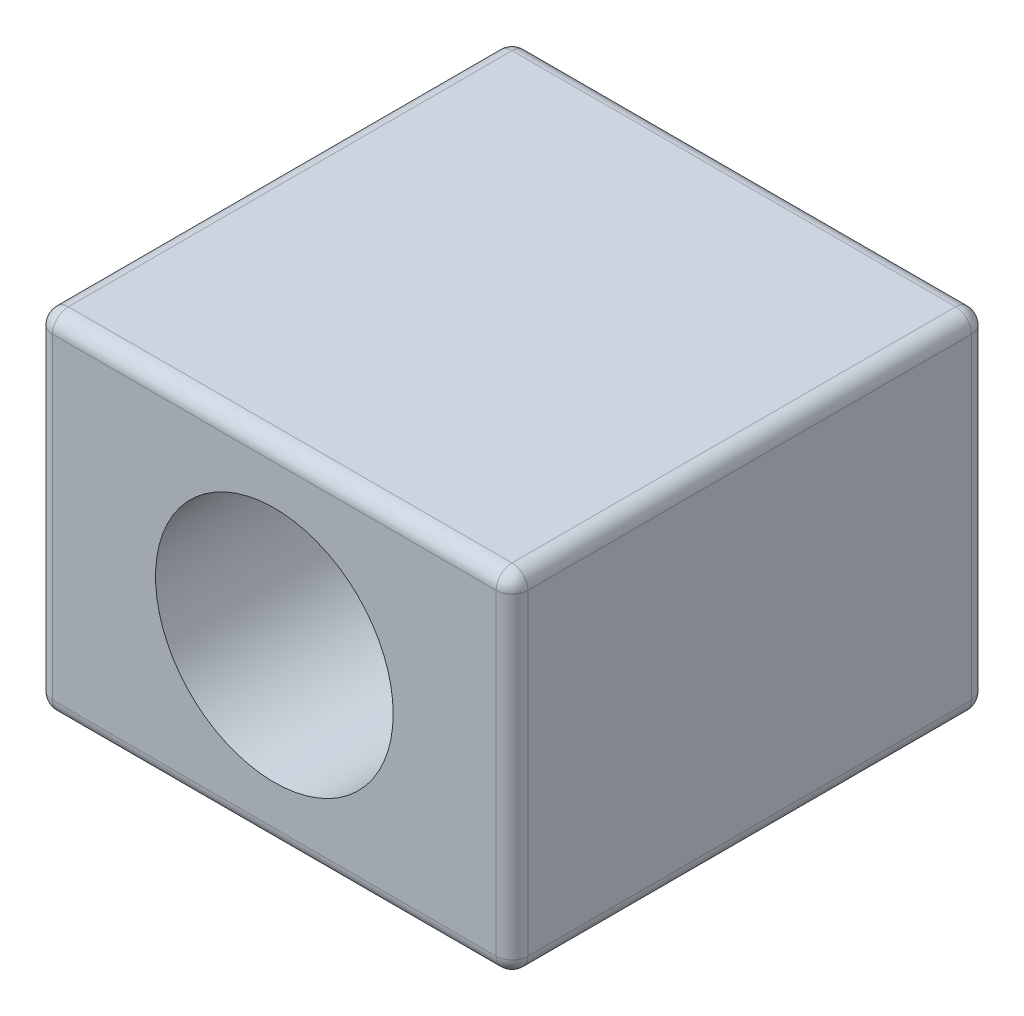
ISO-10303-21;
HEADER;
FILE_DESCRIPTION(('STEP AP214'),'2;1');
FILE_NAME('part.step','',(''),(''),'','','');
FILE_SCHEMA(('AUTOMOTIVE_DESIGN { 1 0 10303 214 1 1 1 1 }'));
ENDSEC;
DATA;
#1=APPLICATION_CONTEXT('core data for automotive mechanical design processes');
#2=APPLICATION_PROTOCOL_DEFINITION('international standard','automotive_design',2000,#1);
#3=PRODUCT_CONTEXT('',#1,'mechanical');
#4=PRODUCT('Part','Part','',(#3));
#5=PRODUCT_RELATED_PRODUCT_CATEGORY('part','',(#4));
#6=PRODUCT_DEFINITION_FORMATION('','',#4);
#7=PRODUCT_DEFINITION_CONTEXT('part definition',#1,'design');
#8=PRODUCT_DEFINITION('design','',#6,#7);
#9=PRODUCT_DEFINITION_SHAPE('','',#8);
#10=(LENGTH_UNIT() NAMED_UNIT(*) SI_UNIT(.MILLI.,.METRE.));
#11=(NAMED_UNIT(*) PLANE_ANGLE_UNIT() SI_UNIT($,.RADIAN.));
#12=(NAMED_UNIT(*) SI_UNIT($,.STERADIAN.) SOLID_ANGLE_UNIT());
#13=UNCERTAINTY_MEASURE_WITH_UNIT(LENGTH_MEASURE(1.E-05),#10,'distance_accuracy_value','');
#14=(GEOMETRIC_REPRESENTATION_CONTEXT(3) GLOBAL_UNCERTAINTY_ASSIGNED_CONTEXT((#13)) GLOBAL_UNIT_ASSIGNED_CONTEXT((#10,
#11,#12)) REPRESENTATION_CONTEXT('',''));
#15=CARTESIAN_POINT('',(0.,0.,0.));
#16=DIRECTION('',(0.,0.,1.));
#17=DIRECTION('',(1.,0.,0.));
#18=AXIS2_PLACEMENT_3D('',#15,#16,#17);
#19=CARTESIAN_POINT('',(-7.5,-5.50000000000006,7.5));
#20=DIRECTION('',(0.,0.,1.));
#21=DIRECTION('',(1.,0.,0.));
#22=AXIS2_PLACEMENT_3D('',#19,#20,#21);
#23=PLANE('',#22);
#24=DIRECTION('',(0.,-1.,0.));
#25=VECTOR('',#24,1.);
#26=CARTESIAN_POINT('',(-7.,-5.50000000000006,7.5));
#27=LINE('',#26,#25);
#28=CARTESIAN_POINT('',(-7.,5.00000000000006,7.5));
#29=VERTEX_POINT('',#28);
#30=CARTESIAN_POINT('',(-7.,-5.00000000000006,7.5));
#31=VERTEX_POINT('',#30);
#32=EDGE_CURVE('E124',#29,#31,#27,.T.);
#33=ORIENTED_EDGE('',*,*,#32,.T.);
#34=DIRECTION('',(1.,0.,0.));
#35=VECTOR('',#34,1.);
#36=CARTESIAN_POINT('',(7.5,-5.00000000000006,7.5));
#37=LINE('',#36,#35);
#38=CARTESIAN_POINT('',(7.,-5.00000000000006,7.5));
#39=VERTEX_POINT('',#38);
#40=EDGE_CURVE('E163',#31,#39,#37,.T.);
#41=ORIENTED_EDGE('',*,*,#40,.T.);
#42=DIRECTION('',(0.,1.,0.));
#43=VECTOR('',#42,1.);
#44=CARTESIAN_POINT('',(7.,5.50000000000006,7.5));
#45=LINE('',#44,#43);
#46=CARTESIAN_POINT('',(7.,5.00000000000006,7.5));
#47=VERTEX_POINT('',#46);
#48=EDGE_CURVE('E127',#39,#47,#45,.T.);
#49=ORIENTED_EDGE('',*,*,#48,.T.);
#50=DIRECTION('',(-1.,0.,0.));
#51=VECTOR('',#50,1.);
#52=CARTESIAN_POINT('',(-7.5,5.00000000000006,7.5));
#53=LINE('',#52,#51);
#54=EDGE_CURVE('E119',#47,#29,#53,.T.);
#55=ORIENTED_EDGE('',*,*,#54,.T.);
#56=EDGE_LOOP('',(#33,#41,#49,#55));
#57=FACE_BOUND('',#56,.T.);
#58=CARTESIAN_POINT('',(0.,0.,7.5));
#59=DIRECTION('',(0.,0.,1.));
#60=DIRECTION('',(1.,0.,0.));
#61=AXIS2_PLACEMENT_3D('',#58,#59,#60);
#62=CIRCLE('',#61,3.75);
#63=CARTESIAN_POINT('',(3.75,0.,7.5));
#64=VERTEX_POINT('',#63);
#65=EDGE_CURVE('E155',#64,#64,#62,.T.);
#66=ORIENTED_EDGE('',*,*,#65,.F.);
#67=EDGE_LOOP('',(#66));
#68=FACE_BOUND('',#67,.T.);
#69=ADVANCED_FACE('F32',(#57,#68),#23,.T.);
#70=CARTESIAN_POINT('',(-7.5,-5.50000000000006,-7.5));
#71=DIRECTION('',(0.,0.,1.));
#72=DIRECTION('',(1.,0.,0.));
#73=AXIS2_PLACEMENT_3D('',#70,#71,#72);
#74=PLANE('',#73);
#75=DIRECTION('',(0.,1.,0.));
#76=VECTOR('',#75,1.);
#77=CARTESIAN_POINT('',(7.,-5.50000000000006,-7.5));
#78=LINE('',#77,#76);
#79=CARTESIAN_POINT('',(7.,5.00000000000006,-7.5));
#80=VERTEX_POINT('',#79);
#81=CARTESIAN_POINT('',(7.,-5.00000000000006,-7.5));
#82=VERTEX_POINT('',#81);
#83=EDGE_CURVE('E178',#80,#82,#78,.F.);
#84=ORIENTED_EDGE('',*,*,#83,.T.);
#85=DIRECTION('',(1.,0.,0.));
#86=VECTOR('',#85,1.);
#87=CARTESIAN_POINT('',(-7.5,-5.00000000000006,-7.5));
#88=LINE('',#87,#86);
#89=CARTESIAN_POINT('',(-7.,-5.00000000000006,-7.5));
#90=VERTEX_POINT('',#89);
#91=EDGE_CURVE('E180',#82,#90,#88,.F.);
#92=ORIENTED_EDGE('',*,*,#91,.T.);
#93=DIRECTION('',(0.,-1.,0.));
#94=VECTOR('',#93,1.);
#95=CARTESIAN_POINT('',(-7.,-5.50000000000006,-7.5));
#96=LINE('',#95,#94);
#97=CARTESIAN_POINT('',(-7.,5.00000000000006,-7.5));
#98=VERTEX_POINT('',#97);
#99=EDGE_CURVE('E174',#90,#98,#96,.F.);
#100=ORIENTED_EDGE('',*,*,#99,.T.);
#101=DIRECTION('',(-1.,0.,0.));
#102=VECTOR('',#101,1.);
#103=CARTESIAN_POINT('',(-7.5,5.00000000000006,-7.5));
#104=LINE('',#103,#102);
#105=EDGE_CURVE('E176',#98,#80,#104,.F.);
#106=ORIENTED_EDGE('',*,*,#105,.T.);
#107=EDGE_LOOP('',(#84,#92,#100,#106));
#108=FACE_BOUND('',#107,.T.);
#109=CARTESIAN_POINT('',(0.,0.,-7.5));
#110=DIRECTION('',(0.,0.,1.));
#111=DIRECTION('',(1.,0.,0.));
#112=AXIS2_PLACEMENT_3D('',#109,#110,#111);
#113=CIRCLE('',#112,3.75);
#114=CARTESIAN_POINT('',(3.75,0.,-7.5));
#115=VERTEX_POINT('',#114);
#116=EDGE_CURVE('E158',#115,#115,#113,.T.);
#117=ORIENTED_EDGE('',*,*,#116,.T.);
#118=EDGE_LOOP('',(#117));
#119=FACE_BOUND('',#118,.T.);
#120=ADVANCED_FACE('F265',(#108,#119),#74,.F.);
#121=CARTESIAN_POINT('',(-7.5,5.50000000000006,7.5));
#122=DIRECTION('',(1.,0.,0.));
#123=DIRECTION('',(0.,0.,-1.));
#124=AXIS2_PLACEMENT_3D('',#121,#122,#123);
#125=PLANE('',#124);
#126=DIRECTION('',(0.,-1.,0.));
#127=VECTOR('',#126,1.);
#128=CARTESIAN_POINT('',(-7.5,5.50000000000006,7.));
#129=LINE('',#128,#127);
#130=CARTESIAN_POINT('',(-7.5,-5.00000000000006,7.));
#131=VERTEX_POINT('',#130);
#132=CARTESIAN_POINT('',(-7.5,5.00000000000006,7.));
#133=VERTEX_POINT('',#132);
#134=EDGE_CURVE('E41',#131,#133,#129,.F.);
#135=ORIENTED_EDGE('',*,*,#134,.T.);
#136=DIRECTION('',(0.,0.,-1.));
#137=VECTOR('',#136,1.);
#138=CARTESIAN_POINT('',(-7.5,5.00000000000006,7.5));
#139=LINE('',#138,#137);
#140=CARTESIAN_POINT('',(-7.5,5.00000000000006,-7.));
#141=VERTEX_POINT('',#140);
#142=EDGE_CURVE('E11',#133,#141,#139,.T.);
#143=ORIENTED_EDGE('',*,*,#142,.T.);
#144=DIRECTION('',(0.,-1.,0.));
#145=VECTOR('',#144,1.);
#146=CARTESIAN_POINT('',(-7.5,5.50000000000006,-7.));
#147=LINE('',#146,#145);
#148=CARTESIAN_POINT('',(-7.5,-5.00000000000006,-7.));
#149=VERTEX_POINT('',#148);
#150=EDGE_CURVE('E200',#141,#149,#147,.T.);
#151=ORIENTED_EDGE('',*,*,#150,.T.);
#152=DIRECTION('',(0.,0.,-1.));
#153=VECTOR('',#152,1.);
#154=CARTESIAN_POINT('',(-7.5,-5.00000000000006,7.5));
#155=LINE('',#154,#153);
#156=EDGE_CURVE('E52',#149,#131,#155,.F.);
#157=ORIENTED_EDGE('',*,*,#156,.T.);
#158=EDGE_LOOP('',(#135,#143,#151,#157));
#159=FACE_BOUND('',#158,.T.);
#160=ADVANCED_FACE('F286',(#159),#125,.F.);
#161=CARTESIAN_POINT('',(-7.5,-5.50000000000006,7.5));
#162=DIRECTION('',(0.,1.,0.));
#163=DIRECTION('',(0.,0.,1.));
#164=AXIS2_PLACEMENT_3D('',#161,#162,#163);
#165=PLANE('',#164);
#166=DIRECTION('',(1.,0.,0.));
#167=VECTOR('',#166,1.);
#168=CARTESIAN_POINT('',(-7.5,-5.50000000000006,-7.));
#169=LINE('',#168,#167);
#170=CARTESIAN_POINT('',(-7.,-5.50000000000006,-7.));
#171=VERTEX_POINT('',#170);
#172=CARTESIAN_POINT('',(7.,-5.50000000000006,-7.));
#173=VERTEX_POINT('',#172);
#174=EDGE_CURVE('E167',#171,#173,#169,.T.);
#175=ORIENTED_EDGE('',*,*,#174,.T.);
#176=DIRECTION('',(0.,0.,-1.));
#177=VECTOR('',#176,1.);
#178=CARTESIAN_POINT('',(7.,-5.50000000000006,7.5));
#179=LINE('',#178,#177);
#180=CARTESIAN_POINT('',(7.,-5.50000000000006,7.));
#181=VERTEX_POINT('',#180);
#182=EDGE_CURVE('E172',#173,#181,#179,.F.);
#183=ORIENTED_EDGE('',*,*,#182,.T.);
#184=DIRECTION('',(1.,0.,0.));
#185=VECTOR('',#184,1.);
#186=CARTESIAN_POINT('',(-7.5,-5.50000000000006,7.));
#187=LINE('',#186,#185);
#188=CARTESIAN_POINT('',(-7.,-5.50000000000006,7.));
#189=VERTEX_POINT('',#188);
#190=EDGE_CURVE('E169',#181,#189,#187,.F.);
#191=ORIENTED_EDGE('',*,*,#190,.T.);
#192=DIRECTION('',(0.,0.,-1.));
#193=VECTOR('',#192,1.);
#194=CARTESIAN_POINT('',(-7.,-5.50000000000006,7.5));
#195=LINE('',#194,#193);
#196=EDGE_CURVE('E165',#189,#171,#195,.T.);
#197=ORIENTED_EDGE('',*,*,#196,.T.);
#198=EDGE_LOOP('',(#175,#183,#191,#197));
#199=FACE_BOUND('',#198,.T.);
#200=ADVANCED_FACE('F292',(#199),#165,.F.);
#201=CARTESIAN_POINT('',(7.5,5.50000000000006,7.5));
#202=DIRECTION('',(-1.,0.,0.));
#203=DIRECTION('',(0.,0.,1.));
#204=AXIS2_PLACEMENT_3D('',#201,#202,#203);
#205=PLANE('',#204);
#206=DIRECTION('',(0.,1.,0.));
#207=VECTOR('',#206,1.);
#208=CARTESIAN_POINT('',(7.5,-5.50000000000006,7.));
#209=LINE('',#208,#207);
#210=CARTESIAN_POINT('',(7.5,5.00000000000006,7.));
#211=VERTEX_POINT('',#210);
#212=CARTESIAN_POINT('',(7.5,-5.00000000000006,7.));
#213=VERTEX_POINT('',#212);
#214=EDGE_CURVE('E187',#211,#213,#209,.F.);
#215=ORIENTED_EDGE('',*,*,#214,.T.);
#216=DIRECTION('',(0.,0.,-1.));
#217=VECTOR('',#216,1.);
#218=CARTESIAN_POINT('',(7.5,-5.00000000000006,7.5));
#219=LINE('',#218,#217);
#220=CARTESIAN_POINT('',(7.5,-5.00000000000006,-7.));
#221=VERTEX_POINT('',#220);
#222=EDGE_CURVE('E189',#213,#221,#219,.T.);
#223=ORIENTED_EDGE('',*,*,#222,.T.);
#224=DIRECTION('',(0.,1.,0.));
#225=VECTOR('',#224,1.);
#226=CARTESIAN_POINT('',(7.5,5.50000000000006,-7.));
#227=LINE('',#226,#225);
#228=CARTESIAN_POINT('',(7.5,5.00000000000006,-7.));
#229=VERTEX_POINT('',#228);
#230=EDGE_CURVE('E185',#221,#229,#227,.T.);
#231=ORIENTED_EDGE('',*,*,#230,.T.);
#232=DIRECTION('',(0.,0.,-1.));
#233=VECTOR('',#232,1.);
#234=CARTESIAN_POINT('',(7.5,5.00000000000006,7.5));
#235=LINE('',#234,#233);
#236=EDGE_CURVE('E183',#229,#211,#235,.F.);
#237=ORIENTED_EDGE('',*,*,#236,.T.);
#238=EDGE_LOOP('',(#215,#223,#231,#237));
#239=FACE_BOUND('',#238,.T.);
#240=ADVANCED_FACE('F278',(#239),#205,.F.);
#241=CARTESIAN_POINT('',(-7.5,5.50000000000006,7.5));
#242=DIRECTION('',(0.,-1.,0.));
#243=DIRECTION('',(0.,0.,-1.));
#244=AXIS2_PLACEMENT_3D('',#241,#242,#243);
#245=PLANE('',#244);
#246=DIRECTION('',(-1.,0.,0.));
#247=VECTOR('',#246,1.);
#248=CARTESIAN_POINT('',(7.5,5.50000000000006,7.));
#249=LINE('',#248,#247);
#250=CARTESIAN_POINT('',(-7.,5.50000000000006,7.));
#251=VERTEX_POINT('',#250);
#252=CARTESIAN_POINT('',(7.,5.50000000000006,7.));
#253=VERTEX_POINT('',#252);
#254=EDGE_CURVE('E137',#251,#253,#249,.F.);
#255=ORIENTED_EDGE('',*,*,#254,.T.);
#256=DIRECTION('',(0.,0.,-1.));
#257=VECTOR('',#256,1.);
#258=CARTESIAN_POINT('',(7.,5.50000000000006,7.5));
#259=LINE('',#258,#257);
#260=CARTESIAN_POINT('',(7.,5.50000000000006,-7.));
#261=VERTEX_POINT('',#260);
#262=EDGE_CURVE('E197',#253,#261,#259,.T.);
#263=ORIENTED_EDGE('',*,*,#262,.T.);
#264=DIRECTION('',(-1.,0.,0.));
#265=VECTOR('',#264,1.);
#266=CARTESIAN_POINT('',(-7.5,5.50000000000006,-7.));
#267=LINE('',#266,#265);
#268=CARTESIAN_POINT('',(-7.,5.50000000000006,-7.));
#269=VERTEX_POINT('',#268);
#270=EDGE_CURVE('E194',#261,#269,#267,.T.);
#271=ORIENTED_EDGE('',*,*,#270,.T.);
#272=DIRECTION('',(0.,0.,-1.));
#273=VECTOR('',#272,1.);
#274=CARTESIAN_POINT('',(-7.,5.50000000000006,7.5));
#275=LINE('',#274,#273);
#276=EDGE_CURVE('E192',#269,#251,#275,.F.);
#277=ORIENTED_EDGE('',*,*,#276,.T.);
#278=EDGE_LOOP('',(#255,#263,#271,#277));
#279=FACE_BOUND('',#278,.T.);
#280=ADVANCED_FACE('F269',(#279),#245,.F.);
#281=CARTESIAN_POINT('',(0.,0.,7.5));
#282=DIRECTION('',(0.,0.,-1.));
#283=DIRECTION('',(-1.,0.,0.));
#284=AXIS2_PLACEMENT_3D('',#281,#282,#283);
#285=CYLINDRICAL_SURFACE('',#284,3.75);
#286=ORIENTED_EDGE('',*,*,#65,.T.);
#287=EDGE_LOOP('',(#286));
#288=FACE_BOUND('',#287,.T.);
#289=ORIENTED_EDGE('',*,*,#116,.F.);
#290=EDGE_LOOP('',(#289));
#291=FACE_BOUND('',#290,.T.);
#292=ADVANCED_FACE('F267',(#288,#291),#285,.F.);
#293=CARTESIAN_POINT('',(-7.5,5.00000000000006,-7.));
#294=DIRECTION('',(-1.,0.,0.));
#295=DIRECTION('',(0.,0.,1.));
#296=AXIS2_PLACEMENT_3D('',#293,#294,#295);
#297=CYLINDRICAL_SURFACE('',#296,0.5);
#298=CARTESIAN_POINT('',(-7.,5.00000000000006,-7.));
#299=DIRECTION('',(-1.,0.,0.));
#300=DIRECTION('',(0.,0.,1.));
#301=AXIS2_PLACEMENT_3D('',#298,#299,#300);
#302=CIRCLE('',#301,0.5);
#303=EDGE_CURVE('E36',#269,#98,#302,.T.);
#304=ORIENTED_EDGE('',*,*,#303,.F.);
#305=ORIENTED_EDGE('',*,*,#270,.F.);
#306=CARTESIAN_POINT('',(7.,5.00000000000006,-7.));
#307=DIRECTION('',(1.,0.,0.));
#308=DIRECTION('',(0.,0.,-1.));
#309=AXIS2_PLACEMENT_3D('',#306,#307,#308);
#310=CIRCLE('',#309,0.5);
#311=EDGE_CURVE('E250',#80,#261,#310,.T.);
#312=ORIENTED_EDGE('',*,*,#311,.F.);
#313=ORIENTED_EDGE('',*,*,#105,.F.);
#314=EDGE_LOOP('',(#304,#305,#312,#313));
#315=FACE_BOUND('',#314,.T.);
#316=ADVANCED_FACE('F34',(#315),#297,.T.);
#317=CARTESIAN_POINT('',(-7.,5.00000000000006,-7.));
#318=DIRECTION('',(0.,0.,1.));
#319=DIRECTION('',(1.,0.,0.));
#320=AXIS2_PLACEMENT_3D('',#317,#318,#319);
#321=SPHERICAL_SURFACE('',#320,0.5);
#322=CARTESIAN_POINT('',(-7.,5.00000000000006,-7.));
#323=DIRECTION('',(0.,0.,-1.));
#324=DIRECTION('',(-1.,0.,0.));
#325=AXIS2_PLACEMENT_3D('',#322,#323,#324);
#326=CIRCLE('',#325,0.5);
#327=EDGE_CURVE('E245',#269,#141,#326,.F.);
#328=ORIENTED_EDGE('',*,*,#327,.F.);
#329=ORIENTED_EDGE('',*,*,#303,.T.);
#330=CARTESIAN_POINT('',(-7.,5.00000000000006,-7.));
#331=DIRECTION('',(0.,1.,0.));
#332=DIRECTION('',(0.,0.,1.));
#333=AXIS2_PLACEMENT_3D('',#330,#331,#332);
#334=CIRCLE('',#333,0.5);
#335=EDGE_CURVE('E248',#141,#98,#334,.F.);
#336=ORIENTED_EDGE('',*,*,#335,.F.);
#337=EDGE_LOOP('',(#328,#329,#336));
#338=FACE_BOUND('',#337,.T.);
#339=ADVANCED_FACE('F276',(#338),#321,.T.);
#340=CARTESIAN_POINT('',(7.,5.00000000000006,-7.));
#341=DIRECTION('',(0.,0.,1.));
#342=DIRECTION('',(1.,0.,0.));
#343=AXIS2_PLACEMENT_3D('',#340,#341,#342);
#344=SPHERICAL_SURFACE('',#343,0.5);
#345=CARTESIAN_POINT('',(7.,5.00000000000006,-7.));
#346=DIRECTION('',(0.,1.,0.));
#347=DIRECTION('',(0.,0.,1.));
#348=AXIS2_PLACEMENT_3D('',#345,#346,#347);
#349=CIRCLE('',#348,0.5);
#350=EDGE_CURVE('E240',#80,#229,#349,.F.);
#351=ORIENTED_EDGE('',*,*,#350,.F.);
#352=ORIENTED_EDGE('',*,*,#311,.T.);
#353=CARTESIAN_POINT('',(7.,5.00000000000006,-7.));
#354=DIRECTION('',(0.,0.,-1.));
#355=DIRECTION('',(-1.,0.,0.));
#356=AXIS2_PLACEMENT_3D('',#353,#354,#355);
#357=CIRCLE('',#356,0.5);
#358=EDGE_CURVE('E243',#229,#261,#357,.F.);
#359=ORIENTED_EDGE('',*,*,#358,.F.);
#360=EDGE_LOOP('',(#351,#352,#359));
#361=FACE_BOUND('',#360,.T.);
#362=ADVANCED_FACE('F360',(#361),#344,.T.);
#363=CARTESIAN_POINT('',(-7.,5.50000000000006,-7.));
#364=DIRECTION('',(0.,-1.,0.));
#365=DIRECTION('',(0.,0.,-1.));
#366=AXIS2_PLACEMENT_3D('',#363,#364,#365);
#367=CYLINDRICAL_SURFACE('',#366,0.5);
#368=ORIENTED_EDGE('',*,*,#335,.T.);
#369=ORIENTED_EDGE('',*,*,#99,.F.);
#370=CARTESIAN_POINT('',(-7.,-5.00000000000006,-7.));
#371=DIRECTION('',(0.,-1.,0.));
#372=DIRECTION('',(0.,0.,-1.));
#373=AXIS2_PLACEMENT_3D('',#370,#371,#372);
#374=CIRCLE('',#373,0.5);
#375=EDGE_CURVE('E235',#149,#90,#374,.T.);
#376=ORIENTED_EDGE('',*,*,#375,.F.);
#377=ORIENTED_EDGE('',*,*,#150,.F.);
#378=EDGE_LOOP('',(#368,#369,#376,#377));
#379=FACE_BOUND('',#378,.T.);
#380=ADVANCED_FACE('F356',(#379),#367,.T.);
#381=CARTESIAN_POINT('',(-7.,5.00000000000006,7.5));
#382=DIRECTION('',(0.,0.,-1.));
#383=DIRECTION('',(-1.,0.,0.));
#384=AXIS2_PLACEMENT_3D('',#381,#382,#383);
#385=CYLINDRICAL_SURFACE('',#384,0.5);
#386=ORIENTED_EDGE('',*,*,#327,.T.);
#387=ORIENTED_EDGE('',*,*,#142,.F.);
#388=CARTESIAN_POINT('',(-7.,5.00000000000006,7.));
#389=DIRECTION('',(0.,0.,1.));
#390=DIRECTION('',(1.,0.,0.));
#391=AXIS2_PLACEMENT_3D('',#388,#389,#390);
#392=CIRCLE('',#391,0.5);
#393=EDGE_CURVE('E141',#251,#133,#392,.T.);
#394=ORIENTED_EDGE('',*,*,#393,.F.);
#395=ORIENTED_EDGE('',*,*,#276,.F.);
#396=EDGE_LOOP('',(#386,#387,#394,#395));
#397=FACE_BOUND('',#396,.T.);
#398=ADVANCED_FACE('F353',(#397),#385,.T.);
#399=CARTESIAN_POINT('',(-7.5,5.00000000000006,7.));
#400=DIRECTION('',(1.,0.,0.));
#401=DIRECTION('',(0.,0.,-1.));
#402=AXIS2_PLACEMENT_3D('',#399,#400,#401);
#403=CYLINDRICAL_SURFACE('',#402,0.5);
#404=CARTESIAN_POINT('',(7.,5.00000000000006,7.));
#405=DIRECTION('',(1.,0.,0.));
#406=DIRECTION('',(0.,0.,-1.));
#407=AXIS2_PLACEMENT_3D('',#404,#405,#406);
#408=CIRCLE('',#407,0.5);
#409=EDGE_CURVE('E142',#253,#47,#408,.T.);
#410=ORIENTED_EDGE('',*,*,#409,.F.);
#411=ORIENTED_EDGE('',*,*,#254,.F.);
#412=CARTESIAN_POINT('',(-7.,5.00000000000006,7.));
#413=DIRECTION('',(-1.,0.,0.));
#414=DIRECTION('',(0.,0.,1.));
#415=AXIS2_PLACEMENT_3D('',#412,#413,#414);
#416=CIRCLE('',#415,0.5);
#417=EDGE_CURVE('E134',#29,#251,#416,.T.);
#418=ORIENTED_EDGE('',*,*,#417,.F.);
#419=ORIENTED_EDGE('',*,*,#54,.F.);
#420=EDGE_LOOP('',(#410,#411,#418,#419));
#421=FACE_BOUND('',#420,.T.);
#422=ADVANCED_FACE('F136',(#421),#403,.T.);
#423=CARTESIAN_POINT('',(7.,5.00000000000006,7.5));
#424=DIRECTION('',(0.,0.,-1.));
#425=DIRECTION('',(-1.,0.,0.));
#426=AXIS2_PLACEMENT_3D('',#423,#424,#425);
#427=CYLINDRICAL_SURFACE('',#426,0.5);
#428=ORIENTED_EDGE('',*,*,#358,.T.);
#429=ORIENTED_EDGE('',*,*,#262,.F.);
#430=CARTESIAN_POINT('',(7.,5.00000000000006,7.));
#431=DIRECTION('',(0.,0.,1.));
#432=DIRECTION('',(1.,0.,0.));
#433=AXIS2_PLACEMENT_3D('',#430,#431,#432);
#434=CIRCLE('',#433,0.5);
#435=EDGE_CURVE('E230',#211,#253,#434,.T.);
#436=ORIENTED_EDGE('',*,*,#435,.F.);
#437=ORIENTED_EDGE('',*,*,#236,.F.);
#438=EDGE_LOOP('',(#428,#429,#436,#437));
#439=FACE_BOUND('',#438,.T.);
#440=ADVANCED_FACE('F346',(#439),#427,.T.);
#441=CARTESIAN_POINT('',(7.,5.50000000000006,-7.));
#442=DIRECTION('',(0.,1.,0.));
#443=DIRECTION('',(0.,0.,1.));
#444=AXIS2_PLACEMENT_3D('',#441,#442,#443);
#445=CYLINDRICAL_SURFACE('',#444,0.5);
#446=ORIENTED_EDGE('',*,*,#350,.T.);
#447=ORIENTED_EDGE('',*,*,#230,.F.);
#448=CARTESIAN_POINT('',(7.,-5.00000000000006,-7.));
#449=DIRECTION('',(0.,-1.,0.));
#450=DIRECTION('',(0.,0.,-1.));
#451=AXIS2_PLACEMENT_3D('',#448,#449,#450);
#452=CIRCLE('',#451,0.5);
#453=EDGE_CURVE('E227',#82,#221,#452,.T.);
#454=ORIENTED_EDGE('',*,*,#453,.F.);
#455=ORIENTED_EDGE('',*,*,#83,.F.);
#456=EDGE_LOOP('',(#446,#447,#454,#455));
#457=FACE_BOUND('',#456,.T.);
#458=ADVANCED_FACE('F342',(#457),#445,.T.);
#459=CARTESIAN_POINT('',(-7.5,-5.00000000000006,-7.));
#460=DIRECTION('',(1.,0.,0.));
#461=DIRECTION('',(0.,0.,-1.));
#462=AXIS2_PLACEMENT_3D('',#459,#460,#461);
#463=CYLINDRICAL_SURFACE('',#462,0.5);
#464=CARTESIAN_POINT('',(-7.,-5.00000000000006,-7.));
#465=DIRECTION('',(-1.,0.,0.));
#466=DIRECTION('',(0.,0.,1.));
#467=AXIS2_PLACEMENT_3D('',#464,#465,#466);
#468=CIRCLE('',#467,0.5);
#469=EDGE_CURVE('E237',#90,#171,#468,.T.);
#470=ORIENTED_EDGE('',*,*,#469,.F.);
#471=ORIENTED_EDGE('',*,*,#91,.F.);
#472=CARTESIAN_POINT('',(7.,-5.00000000000006,-7.));
#473=DIRECTION('',(1.,0.,0.));
#474=DIRECTION('',(0.,0.,-1.));
#475=AXIS2_PLACEMENT_3D('',#472,#473,#474);
#476=CIRCLE('',#475,0.5);
#477=EDGE_CURVE('E224',#173,#82,#476,.T.);
#478=ORIENTED_EDGE('',*,*,#477,.F.);
#479=ORIENTED_EDGE('',*,*,#174,.F.);
#480=EDGE_LOOP('',(#470,#471,#478,#479));
#481=FACE_BOUND('',#480,.T.);
#482=ADVANCED_FACE('F338',(#481),#463,.T.);
#483=CARTESIAN_POINT('',(-7.,-5.00000000000006,-7.));
#484=DIRECTION('',(0.,0.,1.));
#485=DIRECTION('',(1.,0.,0.));
#486=AXIS2_PLACEMENT_3D('',#483,#484,#485);
#487=SPHERICAL_SURFACE('',#486,0.5);
#488=ORIENTED_EDGE('',*,*,#375,.T.);
#489=ORIENTED_EDGE('',*,*,#469,.T.);
#490=CARTESIAN_POINT('',(-7.,-5.00000000000006,-7.));
#491=DIRECTION('',(0.,0.,-1.));
#492=DIRECTION('',(-1.,0.,0.));
#493=AXIS2_PLACEMENT_3D('',#490,#491,#492);
#494=CIRCLE('',#493,0.5);
#495=EDGE_CURVE('E148',#149,#171,#494,.F.);
#496=ORIENTED_EDGE('',*,*,#495,.F.);
#497=EDGE_LOOP('',(#488,#489,#496));
#498=FACE_BOUND('',#497,.T.);
#499=ADVANCED_FACE('F335',(#498),#487,.T.);
#500=CARTESIAN_POINT('',(-7.,5.00000000000006,7.));
#501=DIRECTION('',(0.,0.,1.));
#502=DIRECTION('',(1.,0.,0.));
#503=AXIS2_PLACEMENT_3D('',#500,#501,#502);
#504=SPHERICAL_SURFACE('',#503,0.5);
#505=ORIENTED_EDGE('',*,*,#417,.T.);
#506=ORIENTED_EDGE('',*,*,#393,.T.);
#507=CARTESIAN_POINT('',(-7.,5.00000000000006,7.));
#508=DIRECTION('',(0.,1.,0.));
#509=DIRECTION('',(0.,0.,1.));
#510=AXIS2_PLACEMENT_3D('',#507,#508,#509);
#511=CIRCLE('',#510,0.5);
#512=EDGE_CURVE('E145',#29,#133,#511,.F.);
#513=ORIENTED_EDGE('',*,*,#512,.F.);
#514=EDGE_LOOP('',(#505,#506,#513));
#515=FACE_BOUND('',#514,.T.);
#516=ADVANCED_FACE('F146',(#515),#504,.T.);
#517=CARTESIAN_POINT('',(7.,5.00000000000006,7.));
#518=DIRECTION('',(0.,0.,1.));
#519=DIRECTION('',(1.,0.,0.));
#520=AXIS2_PLACEMENT_3D('',#517,#518,#519);
#521=SPHERICAL_SURFACE('',#520,0.5);
#522=ORIENTED_EDGE('',*,*,#435,.T.);
#523=ORIENTED_EDGE('',*,*,#409,.T.);
#524=CARTESIAN_POINT('',(7.,5.00000000000006,7.));
#525=DIRECTION('',(0.,1.,0.));
#526=DIRECTION('',(0.,0.,1.));
#527=AXIS2_PLACEMENT_3D('',#524,#525,#526);
#528=CIRCLE('',#527,0.5);
#529=EDGE_CURVE('E149',#211,#47,#528,.F.);
#530=ORIENTED_EDGE('',*,*,#529,.F.);
#531=EDGE_LOOP('',(#522,#523,#530));
#532=FACE_BOUND('',#531,.T.);
#533=ADVANCED_FACE('F328',(#532),#521,.T.);
#534=CARTESIAN_POINT('',(7.,-5.00000000000006,-7.));
#535=DIRECTION('',(0.,0.,1.));
#536=DIRECTION('',(1.,0.,0.));
#537=AXIS2_PLACEMENT_3D('',#534,#535,#536);
#538=SPHERICAL_SURFACE('',#537,0.5);
#539=ORIENTED_EDGE('',*,*,#477,.T.);
#540=ORIENTED_EDGE('',*,*,#453,.T.);
#541=CARTESIAN_POINT('',(7.,-5.00000000000006,-7.));
#542=DIRECTION('',(0.,0.,-1.));
#543=DIRECTION('',(-1.,0.,0.));
#544=AXIS2_PLACEMENT_3D('',#541,#542,#543);
#545=CIRCLE('',#544,0.5);
#546=EDGE_CURVE('E218',#173,#221,#545,.F.);
#547=ORIENTED_EDGE('',*,*,#546,.F.);
#548=EDGE_LOOP('',(#539,#540,#547));
#549=FACE_BOUND('',#548,.T.);
#550=ADVANCED_FACE('F324',(#549),#538,.T.);
#551=CARTESIAN_POINT('',(-7.,-5.00000000000006,7.5));
#552=DIRECTION('',(0.,0.,-1.));
#553=DIRECTION('',(-1.,0.,0.));
#554=AXIS2_PLACEMENT_3D('',#551,#552,#553);
#555=CYLINDRICAL_SURFACE('',#554,0.5);
#556=ORIENTED_EDGE('',*,*,#495,.T.);
#557=ORIENTED_EDGE('',*,*,#196,.F.);
#558=CARTESIAN_POINT('',(-7.,-5.00000000000006,7.));
#559=DIRECTION('',(0.,0.,1.));
#560=DIRECTION('',(1.,0.,0.));
#561=AXIS2_PLACEMENT_3D('',#558,#559,#560);
#562=CIRCLE('',#561,0.5);
#563=EDGE_CURVE('E215',#131,#189,#562,.T.);
#564=ORIENTED_EDGE('',*,*,#563,.F.);
#565=ORIENTED_EDGE('',*,*,#156,.F.);
#566=EDGE_LOOP('',(#556,#557,#564,#565));
#567=FACE_BOUND('',#566,.T.);
#568=ADVANCED_FACE('F321',(#567),#555,.T.);
#569=CARTESIAN_POINT('',(-7.,-5.50000000000006,7.));
#570=DIRECTION('',(0.,1.,0.));
#571=DIRECTION('',(0.,0.,1.));
#572=AXIS2_PLACEMENT_3D('',#569,#570,#571);
#573=CYLINDRICAL_SURFACE('',#572,0.5);
#574=ORIENTED_EDGE('',*,*,#512,.T.);
#575=ORIENTED_EDGE('',*,*,#134,.F.);
#576=CARTESIAN_POINT('',(-7.,-5.00000000000006,7.));
#577=DIRECTION('',(0.,-1.,0.));
#578=DIRECTION('',(0.,0.,-1.));
#579=AXIS2_PLACEMENT_3D('',#576,#577,#578);
#580=CIRCLE('',#579,0.5);
#581=EDGE_CURVE('E153',#31,#131,#580,.T.);
#582=ORIENTED_EDGE('',*,*,#581,.F.);
#583=ORIENTED_EDGE('',*,*,#32,.F.);
#584=EDGE_LOOP('',(#574,#575,#582,#583));
#585=FACE_BOUND('',#584,.T.);
#586=ADVANCED_FACE('F151',(#585),#573,.T.);
#587=CARTESIAN_POINT('',(7.,-5.50000000000006,7.));
#588=DIRECTION('',(0.,-1.,0.));
#589=DIRECTION('',(0.,0.,-1.));
#590=AXIS2_PLACEMENT_3D('',#587,#588,#589);
#591=CYLINDRICAL_SURFACE('',#590,0.5);
#592=ORIENTED_EDGE('',*,*,#529,.T.);
#593=ORIENTED_EDGE('',*,*,#48,.F.);
#594=CARTESIAN_POINT('',(7.,-5.00000000000006,7.));
#595=DIRECTION('',(0.,-1.,0.));
#596=DIRECTION('',(0.,0.,-1.));
#597=AXIS2_PLACEMENT_3D('',#594,#595,#596);
#598=CIRCLE('',#597,0.5);
#599=EDGE_CURVE('E211',#213,#39,#598,.T.);
#600=ORIENTED_EDGE('',*,*,#599,.F.);
#601=ORIENTED_EDGE('',*,*,#214,.F.);
#602=EDGE_LOOP('',(#592,#593,#600,#601));
#603=FACE_BOUND('',#602,.T.);
#604=ADVANCED_FACE('F314',(#603),#591,.T.);
#605=CARTESIAN_POINT('',(7.,-5.00000000000006,7.5));
#606=DIRECTION('',(0.,0.,-1.));
#607=DIRECTION('',(-1.,0.,0.));
#608=AXIS2_PLACEMENT_3D('',#605,#606,#607);
#609=CYLINDRICAL_SURFACE('',#608,0.5);
#610=ORIENTED_EDGE('',*,*,#546,.T.);
#611=ORIENTED_EDGE('',*,*,#222,.F.);
#612=CARTESIAN_POINT('',(7.,-5.00000000000006,7.));
#613=DIRECTION('',(0.,0.,1.));
#614=DIRECTION('',(1.,0.,0.));
#615=AXIS2_PLACEMENT_3D('',#612,#613,#614);
#616=CIRCLE('',#615,0.5);
#617=EDGE_CURVE('E208',#181,#213,#616,.T.);
#618=ORIENTED_EDGE('',*,*,#617,.F.);
#619=ORIENTED_EDGE('',*,*,#182,.F.);
#620=EDGE_LOOP('',(#610,#611,#618,#619));
#621=FACE_BOUND('',#620,.T.);
#622=ADVANCED_FACE('F310',(#621),#609,.T.);
#623=CARTESIAN_POINT('',(-7.,-5.00000000000006,7.));
#624=DIRECTION('',(0.,0.,1.));
#625=DIRECTION('',(1.,0.,0.));
#626=AXIS2_PLACEMENT_3D('',#623,#624,#625);
#627=SPHERICAL_SURFACE('',#626,0.5);
#628=ORIENTED_EDGE('',*,*,#581,.T.);
#629=ORIENTED_EDGE('',*,*,#563,.T.);
#630=CARTESIAN_POINT('',(-7.,-5.00000000000006,7.));
#631=DIRECTION('',(-1.,0.,0.));
#632=DIRECTION('',(0.,0.,1.));
#633=AXIS2_PLACEMENT_3D('',#630,#631,#632);
#634=CIRCLE('',#633,0.5);
#635=EDGE_CURVE('E206',#31,#189,#634,.F.);
#636=ORIENTED_EDGE('',*,*,#635,.F.);
#637=EDGE_LOOP('',(#628,#629,#636));
#638=FACE_BOUND('',#637,.T.);
#639=ADVANCED_FACE('F306',(#638),#627,.T.);
#640=CARTESIAN_POINT('',(7.,-5.00000000000006,7.));
#641=DIRECTION('',(0.,0.,1.));
#642=DIRECTION('',(1.,0.,0.));
#643=AXIS2_PLACEMENT_3D('',#640,#641,#642);
#644=SPHERICAL_SURFACE('',#643,0.5);
#645=ORIENTED_EDGE('',*,*,#617,.T.);
#646=ORIENTED_EDGE('',*,*,#599,.T.);
#647=CARTESIAN_POINT('',(7.,-5.00000000000006,7.));
#648=DIRECTION('',(1.,0.,0.));
#649=DIRECTION('',(0.,0.,-1.));
#650=AXIS2_PLACEMENT_3D('',#647,#648,#649);
#651=CIRCLE('',#650,0.5);
#652=EDGE_CURVE('E204',#181,#39,#651,.F.);
#653=ORIENTED_EDGE('',*,*,#652,.F.);
#654=EDGE_LOOP('',(#645,#646,#653));
#655=FACE_BOUND('',#654,.T.);
#656=ADVANCED_FACE('F302',(#655),#644,.T.);
#657=CARTESIAN_POINT('',(-7.5,-5.00000000000006,7.));
#658=DIRECTION('',(-1.,0.,0.));
#659=DIRECTION('',(0.,0.,1.));
#660=AXIS2_PLACEMENT_3D('',#657,#658,#659);
#661=CYLINDRICAL_SURFACE('',#660,0.5);
#662=ORIENTED_EDGE('',*,*,#635,.T.);
#663=ORIENTED_EDGE('',*,*,#190,.F.);
#664=ORIENTED_EDGE('',*,*,#652,.T.);
#665=ORIENTED_EDGE('',*,*,#40,.F.);
#666=EDGE_LOOP('',(#662,#663,#664,#665));
#667=FACE_BOUND('',#666,.T.);
#668=ADVANCED_FACE('F299',(#667),#661,.T.);
#669=CLOSED_SHELL('',(#69,#120,#160,#200,#240,#280,#292,#316,#339,#362,#380,#398,#422,#440,#458,
#482,#499,#516,#533,#550,#568,#586,#604,#622,#639,#656,#668));
#670=MANIFOLD_SOLID_BREP('B2',#669);
#671=ADVANCED_BREP_SHAPE_REPRESENTATION('',(#18,#670),#14);
#672=SHAPE_DEFINITION_REPRESENTATION(#9,#671);
ENDSEC;
END-ISO-10303-21;
